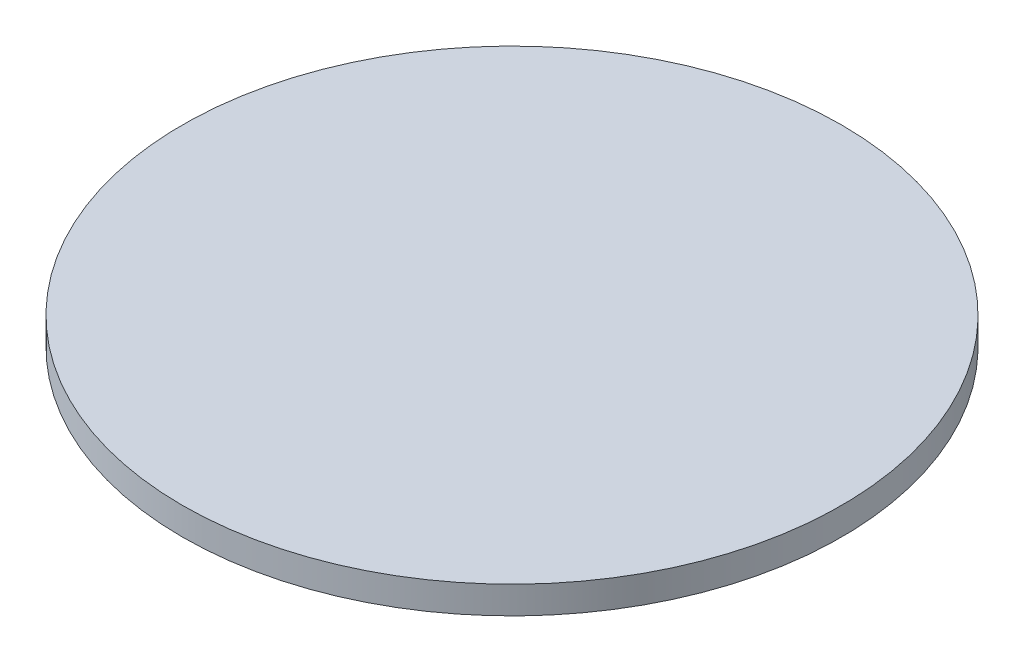
ISO-10303-21;
HEADER;
FILE_DESCRIPTION(('STEP AP214'),'2;1');
FILE_NAME('part.step','',(''),(''),'','','');
FILE_SCHEMA(('AUTOMOTIVE_DESIGN { 1 0 10303 214 1 1 1 1 }'));
ENDSEC;
DATA;
#1=APPLICATION_CONTEXT('core data for automotive mechanical design processes');
#2=APPLICATION_PROTOCOL_DEFINITION('international standard','automotive_design',2000,#1);
#3=PRODUCT_CONTEXT('',#1,'mechanical');
#4=PRODUCT('Part','Part','',(#3));
#5=PRODUCT_RELATED_PRODUCT_CATEGORY('part','',(#4));
#6=PRODUCT_DEFINITION_FORMATION('','',#4);
#7=PRODUCT_DEFINITION_CONTEXT('part definition',#1,'design');
#8=PRODUCT_DEFINITION('design','',#6,#7);
#9=PRODUCT_DEFINITION_SHAPE('','',#8);
#10=(LENGTH_UNIT() NAMED_UNIT(*) SI_UNIT(.MILLI.,.METRE.));
#11=(NAMED_UNIT(*) PLANE_ANGLE_UNIT() SI_UNIT($,.RADIAN.));
#12=(NAMED_UNIT(*) SI_UNIT($,.STERADIAN.) SOLID_ANGLE_UNIT());
#13=UNCERTAINTY_MEASURE_WITH_UNIT(LENGTH_MEASURE(1.E-05),#10,'distance_accuracy_value','');
#14=(GEOMETRIC_REPRESENTATION_CONTEXT(3) GLOBAL_UNCERTAINTY_ASSIGNED_CONTEXT((#13)) GLOBAL_UNIT_ASSIGNED_CONTEXT((#10,
#11,#12)) REPRESENTATION_CONTEXT('',''));
#15=CARTESIAN_POINT('',(0.,0.,0.));
#16=DIRECTION('',(0.,0.,1.));
#17=DIRECTION('',(1.,0.,0.));
#18=AXIS2_PLACEMENT_3D('',#15,#16,#17);
#19=CARTESIAN_POINT('',(0.,1.5875,0.));
#20=DIRECTION('',(0.,-1.,0.));
#21=DIRECTION('',(0.,0.,-1.));
#22=AXIS2_PLACEMENT_3D('',#19,#20,#21);
#23=CYLINDRICAL_SURFACE('',#22,38.1);
#24=CARTESIAN_POINT('',(0.,1.5875,0.));
#25=DIRECTION('',(0.,1.,0.));
#26=DIRECTION('',(0.,0.,1.));
#27=AXIS2_PLACEMENT_3D('',#24,#25,#26);
#28=CIRCLE('',#27,38.1);
#29=CARTESIAN_POINT('',(0.,1.5875,38.1));
#30=VERTEX_POINT('',#29);
#31=EDGE_CURVE('E10',#30,#30,#28,.T.);
#32=ORIENTED_EDGE('',*,*,#31,.F.);
#33=EDGE_LOOP('',(#32));
#34=FACE_BOUND('',#33,.T.);
#35=CARTESIAN_POINT('',(0.,-1.5875,0.));
#36=DIRECTION('',(0.,1.,0.));
#37=DIRECTION('',(0.,0.,1.));
#38=AXIS2_PLACEMENT_3D('',#35,#36,#37);
#39=CIRCLE('',#38,38.1);
#40=CARTESIAN_POINT('',(0.,-1.5875,38.1));
#41=VERTEX_POINT('',#40);
#42=EDGE_CURVE('E38',#41,#41,#39,.T.);
#43=ORIENTED_EDGE('',*,*,#42,.T.);
#44=EDGE_LOOP('',(#43));
#45=FACE_BOUND('',#44,.T.);
#46=ADVANCED_FACE('F32',(#34,#45),#23,.T.);
#47=CARTESIAN_POINT('',(0.,1.5875,0.));
#48=DIRECTION('',(0.,1.,0.));
#49=DIRECTION('',(0.,0.,1.));
#50=AXIS2_PLACEMENT_3D('',#47,#48,#49);
#51=PLANE('',#50);
#52=ORIENTED_EDGE('',*,*,#31,.T.);
#53=EDGE_LOOP('',(#52));
#54=FACE_BOUND('',#53,.T.);
#55=ADVANCED_FACE('F47',(#54),#51,.T.);
#56=CARTESIAN_POINT('',(0.,-1.5875,0.));
#57=DIRECTION('',(0.,1.,0.));
#58=DIRECTION('',(0.,0.,1.));
#59=AXIS2_PLACEMENT_3D('',#56,#57,#58);
#60=PLANE('',#59);
#61=ORIENTED_EDGE('',*,*,#42,.F.);
#62=EDGE_LOOP('',(#61));
#63=FACE_BOUND('',#62,.T.);
#64=ADVANCED_FACE('F45',(#63),#60,.F.);
#65=CLOSED_SHELL('',(#46,#55,#64));
#66=MANIFOLD_SOLID_BREP('B2',#65);
#67=ADVANCED_BREP_SHAPE_REPRESENTATION('',(#18,#66),#14);
#68=SHAPE_DEFINITION_REPRESENTATION(#9,#67);
ENDSEC;
END-ISO-10303-21;
